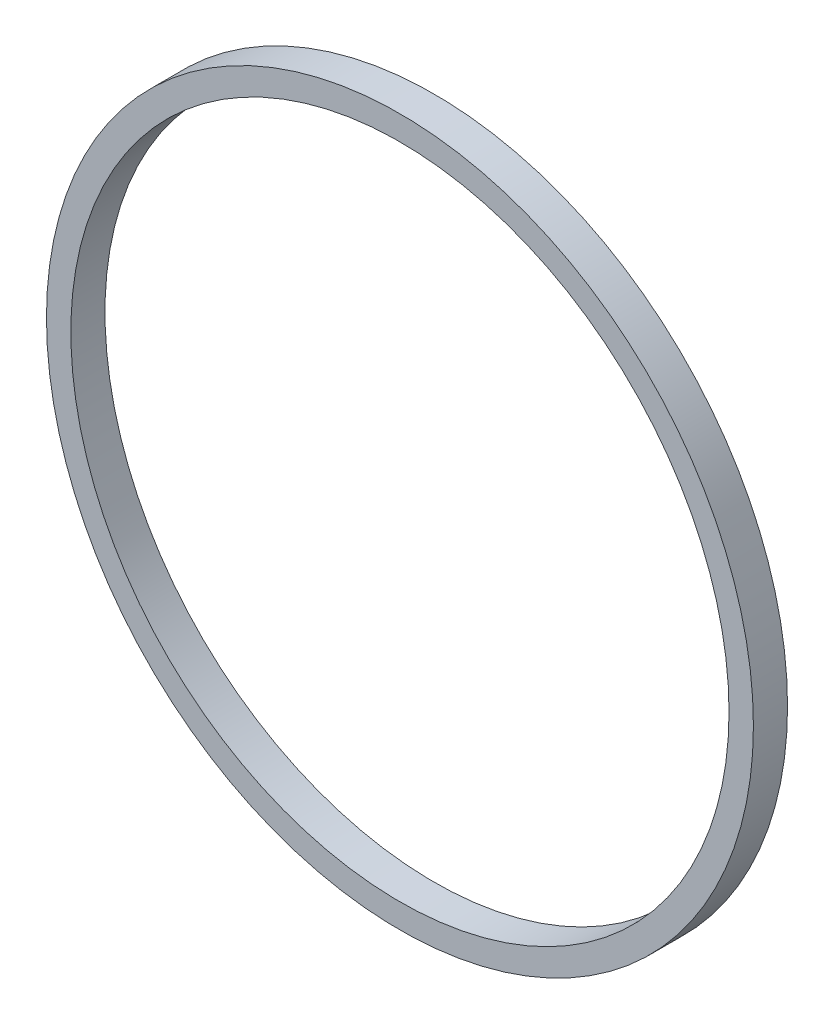
ISO-10303-21;
HEADER;
FILE_DESCRIPTION(('STEP AP214'),'2;1');
FILE_NAME('part.step','',(''),(''),'','','');
FILE_SCHEMA(('AUTOMOTIVE_DESIGN { 1 0 10303 214 1 1 1 1 }'));
ENDSEC;
DATA;
#1=APPLICATION_CONTEXT('core data for automotive mechanical design processes');
#2=APPLICATION_PROTOCOL_DEFINITION('international standard','automotive_design',2000,#1);
#3=PRODUCT_CONTEXT('',#1,'mechanical');
#4=PRODUCT('Part','Part','',(#3));
#5=PRODUCT_RELATED_PRODUCT_CATEGORY('part','',(#4));
#6=PRODUCT_DEFINITION_FORMATION('','',#4);
#7=PRODUCT_DEFINITION_CONTEXT('part definition',#1,'design');
#8=PRODUCT_DEFINITION('design','',#6,#7);
#9=PRODUCT_DEFINITION_SHAPE('','',#8);
#10=(LENGTH_UNIT() NAMED_UNIT(*) SI_UNIT(.MILLI.,.METRE.));
#11=(NAMED_UNIT(*) PLANE_ANGLE_UNIT() SI_UNIT($,.RADIAN.));
#12=(NAMED_UNIT(*) SI_UNIT($,.STERADIAN.) SOLID_ANGLE_UNIT());
#13=UNCERTAINTY_MEASURE_WITH_UNIT(LENGTH_MEASURE(1.E-05),#10,'distance_accuracy_value','');
#14=(GEOMETRIC_REPRESENTATION_CONTEXT(3) GLOBAL_UNCERTAINTY_ASSIGNED_CONTEXT((#13)) GLOBAL_UNIT_ASSIGNED_CONTEXT((#10,
#11,#12)) REPRESENTATION_CONTEXT('',''));
#15=CARTESIAN_POINT('',(0.,0.,0.));
#16=DIRECTION('',(0.,0.,1.));
#17=DIRECTION('',(1.,0.,0.));
#18=AXIS2_PLACEMENT_3D('',#15,#16,#17);
#19=CARTESIAN_POINT('',(0.,0.,1.4));
#20=DIRECTION('',(0.,0.,1.));
#21=DIRECTION('',(1.,0.,0.));
#22=AXIS2_PLACEMENT_3D('',#19,#20,#21);
#23=PLANE('',#22);
#24=CARTESIAN_POINT('',(0.,0.,1.4));
#25=DIRECTION('',(0.,0.,1.));
#26=DIRECTION('',(1.,0.,0.));
#27=AXIS2_PLACEMENT_3D('',#24,#25,#26);
#28=CIRCLE('',#27,14.5);
#29=CARTESIAN_POINT('',(14.5,0.,1.4));
#30=VERTEX_POINT('',#29);
#31=EDGE_CURVE('E10',#30,#30,#28,.T.);
#32=ORIENTED_EDGE('',*,*,#31,.T.);
#33=EDGE_LOOP('',(#32));
#34=FACE_BOUND('',#33,.T.);
#35=CARTESIAN_POINT('',(0.,0.,1.4));
#36=DIRECTION('',(0.,0.,1.));
#37=DIRECTION('',(1.,0.,0.));
#38=AXIS2_PLACEMENT_3D('',#35,#36,#37);
#39=CIRCLE('',#38,13.5);
#40=CARTESIAN_POINT('',(13.5,0.,1.4));
#41=VERTEX_POINT('',#40);
#42=EDGE_CURVE('E50',#41,#41,#39,.T.);
#43=ORIENTED_EDGE('',*,*,#42,.F.);
#44=EDGE_LOOP('',(#43));
#45=FACE_BOUND('',#44,.T.);
#46=ADVANCED_FACE('F39',(#34,#45),#23,.T.);
#47=CARTESIAN_POINT('',(0.,0.,0.));
#48=DIRECTION('',(0.,0.,1.));
#49=DIRECTION('',(1.,0.,0.));
#50=AXIS2_PLACEMENT_3D('',#47,#48,#49);
#51=PLANE('',#50);
#52=CARTESIAN_POINT('',(0.,0.,0.));
#53=DIRECTION('',(0.,0.,1.));
#54=DIRECTION('',(1.,0.,0.));
#55=AXIS2_PLACEMENT_3D('',#52,#53,#54);
#56=CIRCLE('',#55,14.5);
#57=CARTESIAN_POINT('',(14.5,0.,0.));
#58=VERTEX_POINT('',#57);
#59=EDGE_CURVE('E43',#58,#58,#56,.T.);
#60=ORIENTED_EDGE('',*,*,#59,.F.);
#61=EDGE_LOOP('',(#60));
#62=FACE_BOUND('',#61,.T.);
#63=CARTESIAN_POINT('',(0.,0.,0.));
#64=DIRECTION('',(0.,0.,1.));
#65=DIRECTION('',(1.,0.,0.));
#66=AXIS2_PLACEMENT_3D('',#63,#64,#65);
#67=CIRCLE('',#66,13.5);
#68=CARTESIAN_POINT('',(13.5,0.,0.));
#69=VERTEX_POINT('',#68);
#70=EDGE_CURVE('E52',#69,#69,#67,.T.);
#71=ORIENTED_EDGE('',*,*,#70,.T.);
#72=EDGE_LOOP('',(#71));
#73=FACE_BOUND('',#72,.T.);
#74=ADVANCED_FACE('F62',(#62,#73),#51,.F.);
#75=CARTESIAN_POINT('',(0.,0.,1.4));
#76=DIRECTION('',(0.,0.,-1.));
#77=DIRECTION('',(-1.,0.,0.));
#78=AXIS2_PLACEMENT_3D('',#75,#76,#77);
#79=CYLINDRICAL_SURFACE('',#78,14.5);
#80=ORIENTED_EDGE('',*,*,#31,.F.);
#81=EDGE_LOOP('',(#80));
#82=FACE_BOUND('',#81,.T.);
#83=ORIENTED_EDGE('',*,*,#59,.T.);
#84=EDGE_LOOP('',(#83));
#85=FACE_BOUND('',#84,.T.);
#86=ADVANCED_FACE('F41',(#82,#85),#79,.T.);
#87=CARTESIAN_POINT('',(0.,0.,1.4));
#88=DIRECTION('',(0.,0.,-1.));
#89=DIRECTION('',(-1.,0.,0.));
#90=AXIS2_PLACEMENT_3D('',#87,#88,#89);
#91=CYLINDRICAL_SURFACE('',#90,13.5);
#92=ORIENTED_EDGE('',*,*,#42,.T.);
#93=EDGE_LOOP('',(#92));
#94=FACE_BOUND('',#93,.T.);
#95=ORIENTED_EDGE('',*,*,#70,.F.);
#96=EDGE_LOOP('',(#95));
#97=FACE_BOUND('',#96,.T.);
#98=ADVANCED_FACE('F58',(#94,#97),#91,.F.);
#99=CLOSED_SHELL('',(#46,#74,#86,#98));
#100=MANIFOLD_SOLID_BREP('B2',#99);
#101=ADVANCED_BREP_SHAPE_REPRESENTATION('',(#18,#100),#14);
#102=SHAPE_DEFINITION_REPRESENTATION(#9,#101);
ENDSEC;
END-ISO-10303-21;
